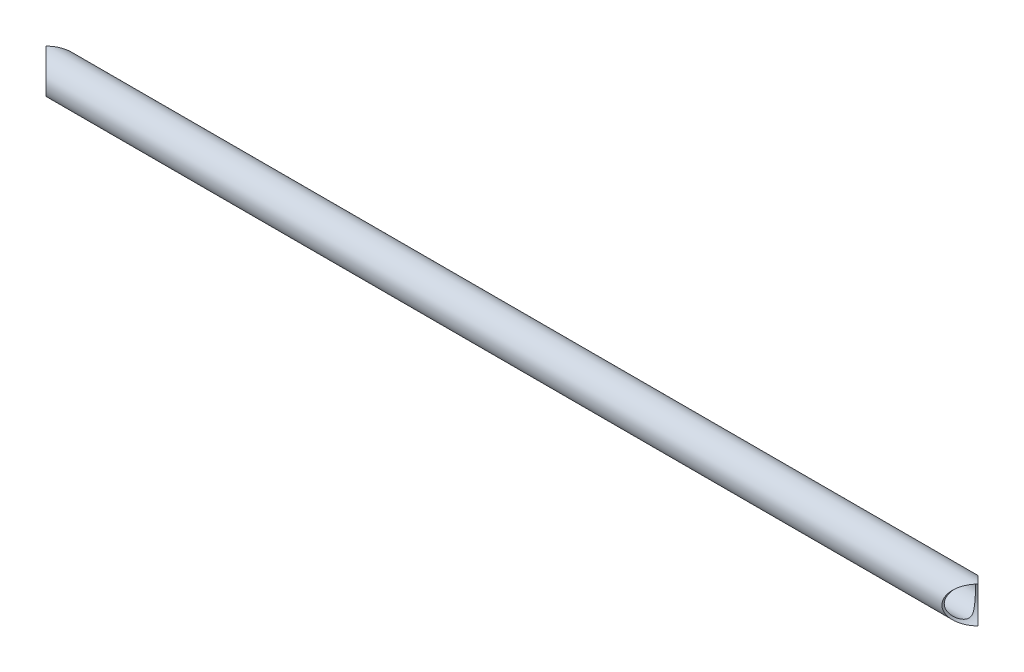
ISO-10303-21;
HEADER;
FILE_DESCRIPTION(('STEP AP214'),'2;1');
FILE_NAME('part.step','',(''),(''),'','','');
FILE_SCHEMA(('AUTOMOTIVE_DESIGN { 1 0 10303 214 1 1 1 1 }'));
ENDSEC;
DATA;
#1=APPLICATION_CONTEXT('core data for automotive mechanical design processes');
#2=APPLICATION_PROTOCOL_DEFINITION('international standard','automotive_design',2000,#1);
#3=PRODUCT_CONTEXT('',#1,'mechanical');
#4=PRODUCT('Part','Part','',(#3));
#5=PRODUCT_RELATED_PRODUCT_CATEGORY('part','',(#4));
#6=PRODUCT_DEFINITION_FORMATION('','',#4);
#7=PRODUCT_DEFINITION_CONTEXT('part definition',#1,'design');
#8=PRODUCT_DEFINITION('design','',#6,#7);
#9=PRODUCT_DEFINITION_SHAPE('','',#8);
#10=(LENGTH_UNIT() NAMED_UNIT(*) SI_UNIT(.MILLI.,.METRE.));
#11=(NAMED_UNIT(*) PLANE_ANGLE_UNIT() SI_UNIT($,.RADIAN.));
#12=(NAMED_UNIT(*) SI_UNIT($,.STERADIAN.) SOLID_ANGLE_UNIT());
#13=UNCERTAINTY_MEASURE_WITH_UNIT(LENGTH_MEASURE(1.E-05),#10,'distance_accuracy_value','');
#14=(GEOMETRIC_REPRESENTATION_CONTEXT(3) GLOBAL_UNCERTAINTY_ASSIGNED_CONTEXT((#13)) GLOBAL_UNIT_ASSIGNED_CONTEXT((#10,
#11,#12)) REPRESENTATION_CONTEXT('',''));
#15=CARTESIAN_POINT('',(0.,0.,0.));
#16=DIRECTION('',(0.,0.,1.));
#17=DIRECTION('',(1.,0.,0.));
#18=AXIS2_PLACEMENT_3D('',#15,#16,#17);
#19=CARTESIAN_POINT('',(326.558909505122,70.7323036314135,-453.319741375355));
#20=DIRECTION('',(-1.,0.,0.));
#21=DIRECTION('',(0.,0.,1.));
#22=AXIS2_PLACEMENT_3D('',#19,#20,#21);
#23=CYLINDRICAL_SURFACE('',#22,12.7);
#24=CARTESIAN_POINT('',(326.558909505122,70.7323036314135,-453.319741375355));
#25=DIRECTION('',(-0.704053417957916,0.000292435905976184,0.710146956018975));
#26=DIRECTION('',(-0.710147016230988,-0.000289926584820265,-0.704053358262568));
#27=AXIS2_PLACEMENT_3D('',#24,#25,#26);
#28=ELLIPSE('',#27,18.038404013201,12.7);
#29=CARTESIAN_POINT('',(326.558909505122,58.0323047082223,-453.314511562484));
#30=VERTEX_POINT('',#29);
#31=CARTESIAN_POINT('',(326.558909505122,83.4323025546047,-453.324971188226));
#32=VERTEX_POINT('',#31);
#33=EDGE_CURVE('E74',#30,#32,#28,.F.);
#34=ORIENTED_EDGE('',*,*,#33,.F.);
#35=CARTESIAN_POINT('',(326.558909505122,70.7323036314135,-453.319741375355));
#36=DIRECTION('',(-0.710147016230988,-0.000289926584820265,-0.704053358262568));
#37=DIRECTION('',(-0.704053417957916,0.000292435905976184,0.710146956018975));
#38=AXIS2_PLACEMENT_3D('',#35,#36,#37);
#39=ELLIPSE('',#38,17.8836208696666,12.7);
#40=EDGE_CURVE('E76',#32,#30,#39,.F.);
#41=ORIENTED_EDGE('',*,*,#40,.F.);
#42=EDGE_LOOP('',(#34,#41));
#43=FACE_BOUND('',#42,.T.);
#44=CARTESIAN_POINT('',(-326.558909505122,70.7323036314134,-453.319741375355));
#45=DIRECTION('',(-0.710147016230988,0.000289926584820265,0.704053358262568));
#46=DIRECTION('',(-0.704053417957916,-0.000292435905976184,-0.710146956018975));
#47=AXIS2_PLACEMENT_3D('',#44,#45,#46);
#48=ELLIPSE('',#47,17.8836208696666,12.7);
#49=CARTESIAN_POINT('',(-326.558909505122,58.0323047082223,-453.314511562484));
#50=VERTEX_POINT('',#49);
#51=CARTESIAN_POINT('',(-326.558909505122,83.4323025546046,-453.324971188226));
#52=VERTEX_POINT('',#51);
#53=EDGE_CURVE('E80',#50,#52,#48,.T.);
#54=ORIENTED_EDGE('',*,*,#53,.F.);
#55=CARTESIAN_POINT('',(-326.558909505122,70.7323036314134,-453.319741375355));
#56=DIRECTION('',(-0.704053417957916,-0.000292435905976184,-0.710146956018975));
#57=DIRECTION('',(-0.710147016230988,0.000289926584820265,0.704053358262568));
#58=AXIS2_PLACEMENT_3D('',#55,#56,#57);
#59=ELLIPSE('',#58,18.038404013201,12.7);
#60=EDGE_CURVE('E66',#52,#50,#59,.T.);
#61=ORIENTED_EDGE('',*,*,#60,.F.);
#62=EDGE_LOOP('',(#54,#61));
#63=FACE_BOUND('',#62,.T.);
#64=ADVANCED_FACE('F43',(#43,#63),#23,.T.);
#65=CARTESIAN_POINT('',(326.042536736013,70.7076293309975,-513.238441419259));
#66=DIRECTION('',(0.00861756932355122,0.000411780998272304,0.999962783275139));
#67=DIRECTION('',(0.99996286805379,0.,-0.00861757005416431));
#68=AXIS2_PLACEMENT_3D('',#65,#66,#67);
#69=CYLINDRICAL_SURFACE('',#68,12.7);
#70=CARTESIAN_POINT('',(313.953657778091,70.7323036314135,-442.270741375355));
#71=CARTESIAN_POINT('',(313.953750384609,70.472526484591,-442.270741843989));
#72=CARTESIAN_POINT('',(313.961749851804,70.2127458562461,-442.279918544724));
#73=CARTESIAN_POINT('',(313.993377932162,69.6954266215194,-442.316444763389));
#74=CARTESIAN_POINT('',(314.017007112841,69.4378880968927,-442.343794941203));
#75=CARTESIAN_POINT('',(314.079369892673,68.9270657819943,-442.416159638872));
#76=CARTESIAN_POINT('',(314.118109695327,68.6737837837972,-442.461181413657));
#77=CARTESIAN_POINT('',(314.209858477709,68.1734593340531,-442.568082634941));
#78=CARTESIAN_POINT('',(314.262867640864,67.926416962759,-442.629962298142));
#79=CARTESIAN_POINT('',(314.381731547976,67.4416345343575,-442.769143477332));
#80=CARTESIAN_POINT('',(314.447505946992,67.2038469188565,-442.84634860018));
#81=CARTESIAN_POINT('',(314.590919799252,66.7372249728979,-443.015308963089));
#82=CARTESIAN_POINT('',(314.668558969852,66.508390429323,-443.107063856546));
#83=CARTESIAN_POINT('',(314.834462600854,66.0605512168615,-443.304004788081));
#84=CARTESIAN_POINT('',(314.922728476102,65.8415478622463,-443.409192614741));
#85=CARTESIAN_POINT('',(315.108614696286,65.414011448427,-443.631898775433));
#86=CARTESIAN_POINT('',(315.206237079323,65.2054806855807,-443.7494197965));
#87=CARTESIAN_POINT('',(315.448291545058,64.7220021470306,-444.042661769104));
#88=CARTESIAN_POINT('',(315.59639767731,64.4519847388041,-444.223509379589));
#89=CARTESIAN_POINT('',(315.904842718948,63.9332846947992,-444.604389331525));
#90=CARTESIAN_POINT('',(316.065185936007,63.6846096379653,-444.804428435155));
#91=CARTESIAN_POINT('',(316.395369391014,63.2082106606188,-445.222269201203));
#92=CARTESIAN_POINT('',(316.565231304919,62.9805379650057,-445.44011196941));
#93=CARTESIAN_POINT('',(316.910985378339,62.5467486914764,-445.891744711659));
#94=CARTESIAN_POINT('',(317.08687672614,62.340629226971,-446.125532543257));
#95=CARTESIAN_POINT('',(317.44516719062,61.9456976036155,-446.613290953129));
#96=CARTESIAN_POINT('',(317.627625646923,61.7573321430688,-446.867579186042));
#97=CARTESIAN_POINT('',(317.991711156104,61.4027231324545,-447.391880116777));
#98=CARTESIAN_POINT('',(318.173337912839,61.2364869477486,-447.66189800718));
#99=CARTESIAN_POINT('',(318.530572332579,60.9267629066194,-448.217510094873));
#100=CARTESIAN_POINT('',(318.706191806458,60.7832281302903,-448.503070480917));
#101=CARTESIAN_POINT('',(319.045462665007,60.5193073293983,-449.091387965624));
#102=CARTESIAN_POINT('',(319.209123707533,60.3989024937002,-449.39413082827));
#103=CARTESIAN_POINT('',(319.441231485734,60.2352411899231,-449.867063903036));
#104=CARTESIAN_POINT('',(319.51737342054,60.1828816126961,-450.030363517275));
#105=CARTESIAN_POINT('',(319.662500345144,60.0850811254469,-450.36221080617));
#106=CARTESIAN_POINT('',(319.731484216292,60.0396412963131,-450.530759295775));
#107=CARTESIAN_POINT('',(319.860299783904,59.9562229691269,-450.872820646944));
#108=CARTESIAN_POINT('',(319.920146307257,59.9182323543624,-451.046324911842));
#109=CARTESIAN_POINT('',(320.028683775289,59.8501914811312,-451.398252747902));
#110=CARTESIAN_POINT('',(320.077381329584,59.820136516421,-451.57667333378));
#111=CARTESIAN_POINT('',(320.15534802078,59.7723052464335,-451.911510015253));
#112=CARTESIAN_POINT('',(320.186414747412,59.753377528516,-452.067340866681));
#113=CARTESIAN_POINT('',(320.237606489603,59.7220909253879,-452.381393505433));
#114=CARTESIAN_POINT('',(320.257736680896,59.7097289329985,-452.539614125293));
#115=CARTESIAN_POINT('',(320.286139772453,59.6918364829635,-452.857375771543));
#116=CARTESIAN_POINT('',(320.294422995715,59.6863000783417,-453.016915526399));
#117=CARTESIAN_POINT('',(320.298738383635,59.6821620675106,-453.336254511301));
#118=CARTESIAN_POINT('',(320.294770416488,59.6835605359116,-453.49605374412));
#119=CARTESIAN_POINT('',(320.274755361757,59.6932364090369,-453.814427844494));
#120=CARTESIAN_POINT('',(320.25872718399,59.7015030469207,-453.973004236574));
#121=CARTESIAN_POINT('',(320.21533099613,59.7246865718795,-454.2881294581));
#122=CARTESIAN_POINT('',(320.187958164381,59.7396062868207,-454.444677396211));
#123=CARTESIAN_POINT('',(320.090344181383,59.7939297564818,-454.910321416115));
#124=CARTESIAN_POINT('',(320.004627099982,59.842889010753,-455.215153915057));
#125=CARTESIAN_POINT('',(319.820072380998,59.952902063723,-455.758675901912));
#126=CARTESIAN_POINT('',(319.725959315913,60.0104734076138,-455.999785051794));
#127=CARTESIAN_POINT('',(319.522424038838,60.139605976522,-456.471721811508));
#128=CARTESIAN_POINT('',(319.412991063094,60.2111770519048,-456.702542040713));
#129=CARTESIAN_POINT('',(319.183016012673,60.3675105510868,-457.154971254365));
#130=CARTESIAN_POINT('',(319.06243608797,60.4523186467134,-457.376544848422));
#131=CARTESIAN_POINT('',(318.814050414943,60.6342489446226,-457.810282703948));
#132=CARTESIAN_POINT('',(318.686245530333,60.731369676698,-458.022448084741));
#133=CARTESIAN_POINT('',(318.354590472351,60.9942594297167,-458.552361322893));
#134=CARTESIAN_POINT('',(318.147575372734,61.1684065767729,-458.864001484977));
#135=CARTESIAN_POINT('',(317.730320903922,61.544830735874,-459.467689309739));
#136=CARTESIAN_POINT('',(317.520079914677,61.7471223228399,-459.759726703983));
#137=CARTESIAN_POINT('',(317.102458335844,62.1795700578821,-460.323830795833));
#138=CARTESIAN_POINT('',(316.895074441852,62.4096903599618,-460.595922474445));
#139=CARTESIAN_POINT('',(316.487905882164,62.8982258680933,-461.119466182125));
#140=CARTESIAN_POINT('',(316.288117758095,63.1566279843523,-461.370927666057));
#141=CARTESIAN_POINT('',(315.948209064898,63.6351978960449,-461.792447590752));
#142=CARTESIAN_POINT('',(315.805456492202,63.8492357761126,-461.967362073244));
#143=CARTESIAN_POINT('',(315.528971290505,64.2935620890431,-462.303087706612));
#144=CARTESIAN_POINT('',(315.395236658273,64.523846889428,-462.463901992083));
#145=CARTESIAN_POINT('',(315.139047423935,65.0001563462388,-462.769762095723));
#146=CARTESIAN_POINT('',(315.016579102139,65.2461612233881,-462.914827132603));
#147=CARTESIAN_POINT('',(314.78495368658,65.7535736073472,-463.187647397329));
#148=CARTESIAN_POINT('',(314.675794042988,66.0149781494332,-463.315405941473));
#149=CARTESIAN_POINT('',(314.491433334378,66.5033952202067,-463.530247403956));
#150=CARTESIAN_POINT('',(314.413664097965,66.7280456364559,-463.620504951854));
#151=CARTESIAN_POINT('',(314.269781667784,67.1860773596022,-463.787025163699));
#152=CARTESIAN_POINT('',(314.203665995233,67.4194567969497,-463.863290803953));
#153=CARTESIAN_POINT('',(314.084257722988,67.8937436251614,-464.000748430297));
#154=CARTESIAN_POINT('',(314.030960705053,68.1346483898087,-464.06194561025));
#155=CARTESIAN_POINT('',(313.938188409809,68.6226029280441,-464.168331567883));
#156=CARTESIAN_POINT('',(313.898713280576,68.869652767434,-464.213520174063));
#157=CARTESIAN_POINT('',(313.834250117017,69.3693899943595,-464.287283194732));
#158=CARTESIAN_POINT('',(313.809335701462,69.6220994351456,-464.315773183302));
#159=CARTESIAN_POINT('',(313.774859670757,70.1299320690421,-464.355248058193));
#160=CARTESIAN_POINT('',(313.765298089938,70.3850552675486,-464.366232905372));
#161=CARTESIAN_POINT('',(313.761747926335,70.8955307639237,-464.370483613097));
#162=CARTESIAN_POINT('',(313.767757738824,71.1508830354737,-464.363751299503));
#163=CARTESIAN_POINT('',(313.79520906931,71.6596679820036,-464.332704031545));
#164=CARTESIAN_POINT('',(313.816649869899,71.9131007456707,-464.308389894586));
#165=CARTESIAN_POINT('',(313.87215565214,72.3958245540675,-464.245286157614));
#166=CARTESIAN_POINT('',(313.905071369608,72.6254228077189,-464.207812617217));
#167=CARTESIAN_POINT('',(313.982959747622,73.0799025034037,-464.118945537308));
#168=CARTESIAN_POINT('',(314.027936477992,73.3047823255972,-464.067547299037));
#169=CARTESIAN_POINT('',(314.129163155341,73.7484350080498,-463.951576269117));
#170=CARTESIAN_POINT('',(314.185409854194,73.9672096072494,-463.887007273327));
#171=CARTESIAN_POINT('',(314.308324818595,74.3977811332844,-463.745481738444));
#172=CARTESIAN_POINT('',(314.374996977284,74.6095754175687,-463.668520571468));
#173=CARTESIAN_POINT('',(314.523190153128,75.0409900471927,-463.496847660192));
#174=CARTESIAN_POINT('',(314.605451431234,75.2599979051564,-463.401235444747));
#175=CARTESIAN_POINT('',(314.779713287132,75.6882622840656,-463.197754594864));
#176=CARTESIAN_POINT('',(314.871717685841,75.8975149326752,-463.089881150768));
#177=CARTESIAN_POINT('',(315.160580190159,76.50991950674,-462.749354911958));
#178=CARTESIAN_POINT('',(315.37032143116,76.8978140560724,-462.499757335818));
#179=CARTESIAN_POINT('',(315.761515485426,77.5430570740608,-462.026863342844));
#180=CARTESIAN_POINT('',(315.937826280868,77.8095080845267,-461.811437801883));
#181=CARTESIAN_POINT('',(316.301048488416,78.3176046632087,-461.360816551208));
#182=CARTESIAN_POINT('',(316.48796487964,78.5592384281019,-461.125611530019));
#183=CARTESIAN_POINT('',(316.868917528617,79.0182462680876,-460.636595373829));
#184=CARTESIAN_POINT('',(317.062970221528,79.2355589909183,-460.382739746404));
#185=CARTESIAN_POINT('',(317.453692146444,79.6454724189226,-459.857837590452));
#186=CARTESIAN_POINT('',(317.650360615463,79.8380801629982,-459.58679599156));
#187=CARTESIAN_POINT('',(318.008038815581,80.1676847909596,-459.075596514788));
#188=CARTESIAN_POINT('',(318.16936459994,80.3085489646998,-458.838143201432));
#189=CARTESIAN_POINT('',(318.487442631339,80.5732904743881,-458.350875019481));
#190=CARTESIAN_POINT('',(318.644193812169,80.6971638747747,-458.101057305103));
#191=CARTESIAN_POINT('',(318.948468080147,80.927069140057,-457.588900251279));
#192=CARTESIAN_POINT('',(319.096014980986,81.0331483571577,-457.326596608519));
#193=CARTESIAN_POINT('',(319.376549475645,81.2267689498648,-456.787956983957));
#194=CARTESIAN_POINT('',(319.509548547914,81.314324992233,-456.511632320675));
#195=CARTESIAN_POINT('',(319.766862187957,81.4778148108596,-455.91222219676));
#196=CARTESIAN_POINT('',(319.888619419885,81.5514166103108,-455.587333904903));
#197=CARTESIAN_POINT('',(320.040230201277,81.6403403561355,-455.087161058489));
#198=CARTESIAN_POINT('',(320.085574679541,81.6663906851969,-454.918423355312));
#199=CARTESIAN_POINT('',(320.164159929901,81.7108625511446,-454.57720198217));
#200=CARTESIAN_POINT('',(320.197407215761,81.7292881942987,-454.404720381294));
#201=CARTESIAN_POINT('',(320.2505633445,81.7582417985473,-454.054785177665));
#202=CARTESIAN_POINT('',(320.270298653214,81.7686672106685,-453.877296302454));
#203=CARTESIAN_POINT('',(320.294659860307,81.7809084069078,-453.520986007946));
#204=CARTESIAN_POINT('',(320.299287077398,81.7827249424598,-453.342164706316));
#205=CARTESIAN_POINT('',(320.293196402926,81.7776729822997,-452.984845599121));
#206=CARTESIAN_POINT('',(320.282472840093,81.7708012768698,-452.80634793752));
#207=CARTESIAN_POINT('',(320.246355890164,81.7485643821527,-452.451383716925));
#208=CARTESIAN_POINT('',(320.220960157298,81.7331978347372,-452.274917487317));
#209=CARTESIAN_POINT('',(320.152348164958,81.6916125271343,-451.900481447509));
#210=CARTESIAN_POINT('',(320.107111445623,81.6641613654858,-451.703021863818));
#211=CARTESIAN_POINT('',(320.002018430777,81.5994473410464,-451.313597359277));
#212=CARTESIAN_POINT('',(319.942150499697,81.5621766673724,-451.121636948095));
#213=CARTESIAN_POINT('',(319.810439756687,81.4784662566942,-450.743299797405));
#214=CARTESIAN_POINT('',(319.738561095548,81.4319989910668,-450.556941805609));
#215=CARTESIAN_POINT('',(319.585552469099,81.3306335081465,-450.190535765438));
#216=CARTESIAN_POINT('',(319.504424490278,81.2757371003173,-450.010486372977));
#217=CARTESIAN_POINT('',(319.274227204072,81.115671929268,-449.529091671521));
#218=CARTESIAN_POINT('',(319.118249313267,81.0027373686265,-449.233616588842));
#219=CARTESIAN_POINT('',(318.793981571198,80.7550561065654,-448.65896971818));
#220=CARTESIAN_POINT('',(318.625683136649,80.6202941179604,-448.379809544437));
#221=CARTESIAN_POINT('',(318.282596696257,80.3295754919229,-447.836326558605));
#222=CARTESIAN_POINT('',(318.107800017584,80.1735897321095,-447.572024851469));
#223=CARTESIAN_POINT('',(317.756511661401,79.8408980666099,-447.058147505982));
#224=CARTESIAN_POINT('',(317.580020416533,79.6641973270074,-446.808568219264));
#225=CARTESIAN_POINT('',(317.217156670147,79.2774873719997,-446.307831032799));
#226=CARTESIAN_POINT('',(317.030913854305,79.0660400760352,-446.057686478972));
#227=CARTESIAN_POINT('',(316.664376325206,78.6192790995116,-445.574794271321));
#228=CARTESIAN_POINT('',(316.484082720674,78.3839610031888,-445.342049850159));
#229=CARTESIAN_POINT('',(316.133454120849,77.8898557639405,-444.895941555287));
#230=CARTESIAN_POINT('',(315.963099495482,77.6311176488985,-444.682538984306));
#231=CARTESIAN_POINT('',(315.635605199084,77.0899142470286,-444.276762488547));
#232=CARTESIAN_POINT('',(315.478460226203,76.8074585713925,-444.084380117679));
#233=CARTESIAN_POINT('',(315.221273939928,76.2988683355117,-443.772114528849));
#234=CARTESIAN_POINT('',(315.117272196426,76.0781239479161,-443.646683125049));
#235=CARTESIAN_POINT('',(314.919795960159,75.6248203598707,-443.409693167051));
#236=CARTESIAN_POINT('',(314.82631881434,75.3922641585027,-443.298131115908));
#237=CARTESIAN_POINT('',(314.651453036958,74.9162323589459,-443.090247296199));
#238=CARTESIAN_POINT('',(314.570056454373,74.6727640813585,-442.993915500841));
#239=CARTESIAN_POINT('',(314.420771882033,74.175887727569,-442.817761553033));
#240=CARTESIAN_POINT('',(314.352882958384,73.9224803399894,-442.737938259201));
#241=CARTESIAN_POINT('',(314.237393415828,73.4302352502411,-442.602428297481));
#242=CARTESIAN_POINT('',(314.188523500347,73.1921132579441,-442.545224073337));
#243=CARTESIAN_POINT('',(314.104050199524,72.7103307670541,-442.44645950806));
#244=CARTESIAN_POINT('',(314.068445766956,72.4666707072691,-442.404897932034));
#245=CARTESIAN_POINT('',(314.011220956792,71.9755532395433,-442.338114717019));
#246=CARTESIAN_POINT('',(313.989596838278,71.7280968655969,-442.31288870688));
#247=CARTESIAN_POINT('',(313.960770500003,71.2311959940752,-442.279201477662));
#248=CARTESIAN_POINT('',(313.95356885383,70.9817514178241,-442.270740925354));
#249=CARTESIAN_POINT('',(313.953657778091,70.7323036314135,-442.270741375355));
#250=B_SPLINE_CURVE_WITH_KNOTS('',3,(#70,#71,#72,#73,#74,#75,#76,#77,#78,#79,#80,#81,#82,#83,
#84,#85,#86,#87,#88,#89,#90,#91,#92,#93,#94,#95,#96,#97,#98,#99,#100,#101,#102,#103,#104,#105,
#106,#107,#108,#109,#110,#111,#112,#113,#114,#115,#116,#117,#118,#119,#120,#121,#122,#123,#124,
#125,#126,#127,#128,#129,#130,#131,#132,#133,#134,#135,#136,#137,#138,#139,#140,#141,#142,#143,
#144,#145,#146,#147,#148,#149,#150,#151,#152,#153,#154,#155,#156,#157,#158,#159,#160,#161,#162,
#163,#164,#165,#166,#167,#168,#169,#170,#171,#172,#173,#174,#175,#176,#177,#178,#179,#180,#181,
#182,#183,#184,#185,#186,#187,#188,#189,#190,#191,#192,#193,#194,#195,#196,#197,#198,#199,#200,
#201,#202,#203,#204,#205,#206,#207,#208,#209,#210,#211,#212,#213,#214,#215,#216,#217,#218,#219,
#220,#221,#222,#223,#224,#225,#226,#227,#228,#229,#230,#231,#232,#233,#234,#235,#236,#237,#238,
#239,#240,#241,#242,#243,#244,#245,#246,#247,#248,#249),.UNSPECIFIED.,.T.,.F.,(4,2,2,2,2,2,2,2,
2,2,2,2,2,2,2,2,2,2,2,2,2,2,2,2,2,2,2,2,2,2,2,2,2,2,2,2,2,2,2,2,2,2,2,2,2,2,2,2,2,2,2,2,2,2,2,2,
2,2,2,2,2,2,2,2,2,2,2,2,2,2,2,2,2,2,2,2,2,2,2,2,2,2,2,2,2,2,2,2,2,4),(0.,0.779063181034952,
1.55815465154095,2.33756630687256,3.11698798173117,3.8916543509592,4.66630226894222,
5.44105343833116,6.2159737546437,7.28584280564568,8.35609022238037,9.42888253606805,
10.5015309879065,11.5963881169998,12.6916087448052,13.7845352940028,14.8765691886967,
15.439197580439,16.0019137667098,16.5637069180524,17.1251661453653,17.6047515608577,
18.0841098135908,18.5630501167694,19.0419955727358,19.5201916265661,19.9985911299149,
20.9561749170176,21.7505879008784,22.5455618662405,23.3433419773811,24.1410269180676,
25.3774262777863,26.6144683210135,27.8499335788921,29.0848294200451,30.0173611748492,
30.9496850914035,31.8808581985712,32.8118526196321,33.5739791893177,34.3359434538729,
35.0976447124391,35.8593541308749,36.6248821494495,37.3904118797828,38.1558627207305,
38.9212779770304,39.6253595031716,40.3296789116487,41.0337956189602,41.7381758927384,
42.4956222455243,43.2533667506294,44.7685317750617,45.9232129043498,47.0784406925276,
48.236519925571,49.3942684641531,50.352920095885,51.311793405813,52.2680731177756,
53.2235927840225,54.2840369602062,54.8134938766763,55.3426652823424,55.8785113936687,
56.4143107323068,56.9503080704384,57.4863911269098,58.0987003395419,58.7114980888352,
59.3261586823899,59.9406875122331,60.997078093966,62.0542117604666,63.1128108922045,
64.1711465805651,65.3003492832584,66.4297612548904,67.556861287258,68.6835067630405,
69.5058894047594,70.3280642729801,71.1496955905185,71.9712700822691,72.7195854909989,
73.4678418123789,74.2158978288354,74.9639835952709),.UNSPECIFIED.);
#251=CARTESIAN_POINT('',(313.953657778091,70.7323036314135,-442.270741375355));
#252=VERTEX_POINT('',#251);
#253=EDGE_CURVE('E48',#252,#252,#250,.T.);
#254=ORIENTED_EDGE('',*,*,#253,.F.);
#255=EDGE_LOOP('',(#254));
#256=FACE_BOUND('',#255,.T.);
#257=ORIENTED_EDGE('',*,*,#33,.T.);
#258=ORIENTED_EDGE('',*,*,#40,.T.);
#259=EDGE_LOOP('',(#257,#258));
#260=FACE_BOUND('',#259,.T.);
#261=ADVANCED_FACE('F77',(#256,#260),#69,.F.);
#262=CARTESIAN_POINT('',(-326.042536736013,70.7076293309975,-513.238441419259));
#263=DIRECTION('',(-0.00861756932355122,0.000411780998272304,0.999962783275139));
#264=DIRECTION('',(0.99996286805379,0.,0.00861757005416431));
#265=AXIS2_PLACEMENT_3D('',#262,#263,#264);
#266=CYLINDRICAL_SURFACE('',#265,12.7);
#267=CARTESIAN_POINT('',(-313.953657778091,70.7323036314135,-442.270741375355));
#268=CARTESIAN_POINT('',(-313.953566113715,70.9919748126506,-442.270741835412));
#269=CARTESIAN_POINT('',(-313.961374856135,71.2516549925268,-442.279911042693));
#270=CARTESIAN_POINT('',(-313.992613104889,71.7687866192135,-442.316409877657));
#271=CARTESIAN_POINT('',(-314.016043165128,72.0262379866662,-442.3437401493));
#272=CARTESIAN_POINT('',(-314.078003811742,72.5368990422149,-442.416055278275));
#273=CARTESIAN_POINT('',(-314.116540538306,72.7901069618448,-442.461047314339));
#274=CARTESIAN_POINT('',(-314.207883734015,73.2902969790176,-442.56788187966));
#275=CARTESIAN_POINT('',(-314.260690388583,73.537278995615,-442.629724627876));
#276=CARTESIAN_POINT('',(-314.379155890151,74.0219577664736,-442.768828352544));
#277=CARTESIAN_POINT('',(-314.444734608009,74.2597018617291,-442.84599325724));
#278=CARTESIAN_POINT('',(-314.587764657419,74.7262465881928,-443.014869935208));
#279=CARTESIAN_POINT('',(-314.665215706332,74.9550474321458,-443.106581362181));
#280=CARTESIAN_POINT('',(-314.830753095391,75.4028279718731,-443.303433136024));
#281=CARTESIAN_POINT('',(-314.918840900351,75.621806309258,-443.408575332594));
#282=CARTESIAN_POINT('',(-315.104382185685,76.0492983208627,-443.631187636917));
#283=CARTESIAN_POINT('',(-315.20183770619,76.257809700434,-443.748660430583));
#284=CARTESIAN_POINT('',(-315.443450037247,76.7411277150045,-444.041711692478));
#285=CARTESIAN_POINT('',(-315.591279888014,77.0110145639812,-444.222406251304));
#286=CARTESIAN_POINT('',(-315.899189021182,77.5294758984755,-444.602956184328));
#287=CARTESIAN_POINT('',(-316.059272610038,77.7780428256374,-444.80281830107));
#288=CARTESIAN_POINT('',(-316.388956497433,78.254241624503,-445.220275373082));
#289=CARTESIAN_POINT('',(-316.55857836126,78.4818227114813,-445.43791105982));
#290=CARTESIAN_POINT('',(-316.903883727655,78.9154496010986,-445.889100028556));
#291=CARTESIAN_POINT('',(-317.079566419469,79.1214982693731,-446.122651185596));
#292=CARTESIAN_POINT('',(-317.437474711912,79.5163042659558,-446.609890481796));
#293=CARTESIAN_POINT('',(-317.619760483582,79.7046157677131,-446.86389522236));
#294=CARTESIAN_POINT('',(-317.983562531728,80.0591415562298,-447.387580785275));
#295=CARTESIAN_POINT('',(-318.165078536221,80.2253485754004,-447.657266721666));
#296=CARTESIAN_POINT('',(-318.522189591292,80.535050687914,-448.212164250168));
#297=CARTESIAN_POINT('',(-318.697796094659,80.678591972834,-448.497342631652));
#298=CARTESIAN_POINT('',(-319.037181885369,80.94256880928,-449.084825159397));
#299=CARTESIAN_POINT('',(-319.200970595247,81.0630228984657,-449.387115311119));
#300=CARTESIAN_POINT('',(-319.433650637201,81.2269584834218,-449.859741120437));
#301=CARTESIAN_POINT('',(-319.510142682044,81.2795018138273,-450.023227626519));
#302=CARTESIAN_POINT('',(-319.655997622739,81.3776521366163,-450.355458936987));
#303=CARTESIAN_POINT('',(-319.725359396432,81.4232580377308,-450.524204563621));
#304=CARTESIAN_POINT('',(-319.854956574397,81.5069917189025,-450.866678714025));
#305=CARTESIAN_POINT('',(-319.915206604253,81.5451315126847,-451.040398708418));
#306=CARTESIAN_POINT('',(-320.024568932654,81.6134524835427,-451.392781922211));
#307=CARTESIAN_POINT('',(-320.07368783255,81.64363837944,-451.571442140876));
#308=CARTESIAN_POINT('',(-320.152398053335,81.6916677729946,-451.906576814849));
#309=CARTESIAN_POINT('',(-320.18379750237,81.7106726238846,-452.062457948122));
#310=CARTESIAN_POINT('',(-320.235670554077,81.7421107258356,-452.376634748922));
#311=CARTESIAN_POINT('',(-320.256149336063,81.7545470920861,-452.53492923517));
#312=CARTESIAN_POINT('',(-320.28525095294,81.772582128724,-452.85286310505));
#313=CARTESIAN_POINT('',(-320.293884425908,81.7781869339192,-453.012501152219));
#314=CARTESIAN_POINT('',(-320.298886137781,81.782452300361,-453.332066158832));
#315=CARTESIAN_POINT('',(-320.295254261112,81.7811127961732,-453.491993120984));
#316=CARTESIAN_POINT('',(-320.275879323942,81.7715409624782,-453.81066838932));
#317=CARTESIAN_POINT('',(-320.260153679186,81.7633185432725,-453.969418059254));
#318=CARTESIAN_POINT('',(-320.217318359931,81.7402063329837,-454.284906623535));
#319=CARTESIAN_POINT('',(-320.190203840837,81.7253137043505,-454.441644632888));
#320=CARTESIAN_POINT('',(-320.093289210821,81.671044094681,-454.907872683617));
#321=CARTESIAN_POINT('',(-320.007937136263,81.6220841716663,-455.213111284494));
#322=CARTESIAN_POINT('',(-319.824195458523,81.5122003988433,-455.75642299212));
#323=CARTESIAN_POINT('',(-319.730636887644,81.454825911992,-455.996961187263));
#324=CARTESIAN_POINT('',(-319.528210555326,81.3261540726652,-456.467799061041));
#325=CARTESIAN_POINT('',(-319.419332091195,81.2548469730186,-456.698091432483));
#326=CARTESIAN_POINT('',(-319.190449708165,81.0991079860429,-457.149494938442));
#327=CARTESIAN_POINT('',(-319.070407937404,81.0146307350828,-457.370570860592));
#328=CARTESIAN_POINT('',(-318.823068996823,80.8334282016704,-457.803342267586));
#329=CARTESIAN_POINT('',(-318.695772681117,80.7367043594383,-458.01503885151));
#330=CARTESIAN_POINT('',(-318.364843281721,80.4744971620931,-458.54463273614));
#331=CARTESIAN_POINT('',(-318.157991555208,80.3006087050468,-458.856386907299));
#332=CARTESIAN_POINT('',(-317.74095670903,79.9247292790232,-459.460278155837));
#333=CARTESIAN_POINT('',(-317.530771904024,79.7227236635695,-459.752404890755));
#334=CARTESIAN_POINT('',(-317.11316681226,79.2908767187753,-460.316688604668));
#335=CARTESIAN_POINT('',(-316.905743396089,79.0610705272928,-460.588870108134));
#336=CARTESIAN_POINT('',(-316.498410376089,78.573199058902,-461.112605353471));
#337=CARTESIAN_POINT('',(-316.298497361002,78.3151468251178,-461.364168523167));
#338=CARTESIAN_POINT('',(-315.958035508694,77.836859913136,-461.786211839175));
#339=CARTESIAN_POINT('',(-315.814885803081,77.6227195079447,-461.961518846967));
#340=CARTESIAN_POINT('',(-315.537588411444,77.1781476104,-462.298002980793));
#341=CARTESIAN_POINT('',(-315.40343873105,76.9477197506795,-462.459183239702));
#342=CARTESIAN_POINT('',(-315.146410738637,76.4710822114018,-462.765746323618));
#343=CARTESIAN_POINT('',(-315.02351863857,76.2248924822503,-462.911148514697));
#344=CARTESIAN_POINT('',(-314.791044029924,75.7170633484051,-463.184612682993));
#345=CARTESIAN_POINT('',(-314.681458955542,75.4554269365789,-463.312678003578));
#346=CARTESIAN_POINT('',(-314.496402348084,74.966728298964,-463.527962974369));
#347=CARTESIAN_POINT('',(-314.418352479927,74.7420445633482,-463.618374067767));
#348=CARTESIAN_POINT('',(-314.273899897704,74.2839256451875,-463.785197741084));
#349=CARTESIAN_POINT('',(-314.207494700491,74.0504923413459,-463.861613305608));
#350=CARTESIAN_POINT('',(-314.087502703823,73.5760740203083,-463.999364776657));
#351=CARTESIAN_POINT('',(-314.033911495955,73.3350916325961,-464.060705869472));
#352=CARTESIAN_POINT('',(-313.940551391835,72.8469560016073,-464.167370173587));
#353=CARTESIAN_POINT('',(-313.900782643944,72.5998026921263,-464.212693212959));
#354=CARTESIAN_POINT('',(-313.835736369589,72.0998221429051,-464.286713299015));
#355=CARTESIAN_POINT('',(-313.810533033087,71.8469725538917,-464.315325234216));
#356=CARTESIAN_POINT('',(-313.775493877084,71.3388335870774,-464.355024009255));
#357=CARTESIAN_POINT('',(-313.765658091853,71.0835442038369,-464.366110810012));
#358=CARTESIAN_POINT('',(-313.761580843441,70.5727149380208,-464.370540844382));
#359=CARTESIAN_POINT('',(-313.767337698953,70.3171750854226,-464.363885991025));
#360=CARTESIAN_POINT('',(-313.794309902967,69.8079977260303,-464.332965581713));
#361=CARTESIAN_POINT('',(-313.815524522446,69.5543601300916,-464.30870085628));
#362=CARTESIAN_POINT('',(-313.870608830926,69.071380764004,-464.245682249731));
#363=CARTESIAN_POINT('',(-313.903318796923,68.8417304424476,-464.208256009403));
#364=CARTESIAN_POINT('',(-313.980808600332,68.3871360384955,-464.119474804133));
#365=CARTESIAN_POINT('',(-314.02559251071,68.1621935718697,-464.068115138919));
#366=CARTESIAN_POINT('',(-314.126448853829,67.7184082933215,-463.952211555044));
#367=CARTESIAN_POINT('',(-314.182518037886,67.4995637465878,-463.887671430556));
#368=CARTESIAN_POINT('',(-314.305094511949,67.0688482936989,-463.746193794258));
#369=CARTESIAN_POINT('',(-314.371605702584,66.8569800294675,-463.669251649367));
#370=CARTESIAN_POINT('',(-314.519432349192,66.4255577128326,-463.497666881247));
#371=CARTESIAN_POINT('',(-314.601482212551,66.2066101398362,-463.402131800619));
#372=CARTESIAN_POINT('',(-314.775329071512,65.778455252955,-463.198811066483));
#373=CARTESIAN_POINT('',(-314.867129890115,65.569251805979,-463.091020606904));
#374=CARTESIAN_POINT('',(-315.155395088011,64.9569834390693,-462.75075292575));
#375=CARTESIAN_POINT('',(-315.364756948786,64.5691616642111,-462.501339401088));
#376=CARTESIAN_POINT('',(-315.755292454473,63.9240810483349,-462.028834647986));
#377=CARTESIAN_POINT('',(-315.931310594871,63.6577199438781,-461.813613224117));
#378=CARTESIAN_POINT('',(-316.293977941672,63.1497807512471,-461.363427720422));
#379=CARTESIAN_POINT('',(-316.48063213334,62.9082144358278,-461.128454357657));
#380=CARTESIAN_POINT('',(-316.861103439609,62.4493163255523,-460.639930917061));
#381=CARTESIAN_POINT('',(-317.054937198417,62.2320462328741,-460.386336135547));
#382=CARTESIAN_POINT('',(-317.44527663091,61.8221959337643,-459.861996354473));
#383=CARTESIAN_POINT('',(-317.641781532366,61.6296087526102,-459.591256232173));
#384=CARTESIAN_POINT('',(-317.999885903861,61.2994158699284,-459.079724013972));
#385=CARTESIAN_POINT('',(-318.161783596384,61.1580150818903,-458.841580670895));
#386=CARTESIAN_POINT('',(-318.481030512705,60.8923157251311,-458.352875965238));
#387=CARTESIAN_POINT('',(-318.638378658326,60.7680211845312,-458.102311696649));
#388=CARTESIAN_POINT('',(-318.943842671232,60.5373922013334,-457.588607785696));
#389=CARTESIAN_POINT('',(-319.091982451814,60.4310098977804,-457.325504144929));
#390=CARTESIAN_POINT('',(-319.373663802819,60.2369036561523,-456.78519903499));
#391=CARTESIAN_POINT('',(-319.507216976625,60.1491648342052,-456.508009032309));
#392=CARTESIAN_POINT('',(-319.765188088883,59.9856877661448,-455.907641291805));
#393=CARTESIAN_POINT('',(-319.887119427826,59.9122218415735,-455.582709437822));
#394=CARTESIAN_POINT('',(-320.039026561734,59.8235081043311,-455.08247228305));
#395=CARTESIAN_POINT('',(-320.084475612986,59.7975287512799,-454.913713262543));
#396=CARTESIAN_POINT('',(-320.163279578721,59.753200939767,-454.572447166691));
#397=CARTESIAN_POINT('',(-320.196640999549,59.734848375291,-454.399942160838));
#398=CARTESIAN_POINT('',(-320.250033333903,59.7060437238132,-454.049949109124));
#399=CARTESIAN_POINT('',(-320.269890316048,59.6956944921822,-453.872425634153));
#400=CARTESIAN_POINT('',(-320.294492955703,59.6836093040673,-453.516039620543));
#401=CARTESIAN_POINT('',(-320.299239941809,59.6818725902926,-453.33717720102));
#402=CARTESIAN_POINT('',(-320.293379643938,59.6870885847406,-452.979771880701));
#403=CARTESIAN_POINT('',(-320.282766857299,59.6940444069565,-452.801229117369));
#404=CARTESIAN_POINT('',(-320.246856577263,59.7164541387413,-452.446171487923));
#405=CARTESIAN_POINT('',(-320.221556742621,59.731909403176,-452.269656949703));
#406=CARTESIAN_POINT('',(-320.153169112933,59.7736660916635,-451.89532727376));
#407=CARTESIAN_POINT('',(-320.108076261831,59.8011895213577,-451.698017875733));
#408=CARTESIAN_POINT('',(-320.00327487818,59.8660330216236,-451.308886801896));
#409=CARTESIAN_POINT('',(-319.943554731309,59.9033608787902,-451.117069622846));
#410=CARTESIAN_POINT('',(-319.812137739762,59.9871716069491,-450.739014553256));
#411=CARTESIAN_POINT('',(-319.740405028524,60.033681971372,-450.55279540186));
#412=CARTESIAN_POINT('',(-319.587682628775,60.1351197528026,-450.186664427983));
#413=CARTESIAN_POINT('',(-319.5066949225,60.1900453682852,-450.006751265631));
#414=CARTESIAN_POINT('',(-319.276885294568,60.3501598876105,-449.525759819873));
#415=CARTESIAN_POINT('',(-319.121149944223,60.4630984864808,-449.230548950637));
#416=CARTESIAN_POINT('',(-318.797344137791,60.7107415005181,-448.656427450175));
#417=CARTESIAN_POINT('',(-318.629265076744,60.845461179693,-448.377528438189));
#418=CARTESIAN_POINT('',(-318.286591160686,61.1360474283548,-447.834563896927));
#419=CARTESIAN_POINT('',(-318.111987591331,61.2919430703798,-447.570519478959));
#420=CARTESIAN_POINT('',(-317.761055540064,61.6244048328241,-447.057149139587));
#421=CARTESIAN_POINT('',(-317.584727498314,61.8009657985291,-446.807819570984));
#422=CARTESIAN_POINT('',(-317.222119445055,62.1873828531196,-446.307521414614));
#423=CARTESIAN_POINT('',(-317.035967264156,62.3986792852733,-446.057569390902));
#424=CARTESIAN_POINT('',(-316.669568775437,62.8450897331789,-445.575047909427));
#425=CARTESIAN_POINT('',(-316.489323565833,63.0802081449984,-445.342481673819));
#426=CARTESIAN_POINT('',(-316.138741186204,63.5738677721819,-444.896703343436));
#427=CARTESIAN_POINT('',(-315.968384571034,63.8323602721328,-444.683452768467));
#428=CARTESIAN_POINT('',(-315.640829193313,64.3730265948474,-444.27794528496));
#429=CARTESIAN_POINT('',(-315.483625183701,64.6551908832168,-444.085679995203));
#430=CARTESIAN_POINT('',(-315.226131564987,65.1635348059515,-443.773396967514));
#431=CARTESIAN_POINT('',(-315.121909283577,65.3843501730292,-443.64785924655));
#432=CARTESIAN_POINT('',(-314.923983870488,65.8378098985292,-443.410666439976));
#433=CARTESIAN_POINT('',(-314.830278092282,66.0704512593777,-443.299007860853));
#434=CARTESIAN_POINT('',(-314.6549501046,66.5466698144395,-443.090941754105));
#435=CARTESIAN_POINT('',(-314.573319963988,66.7902396926735,-442.994524213467));
#436=CARTESIAN_POINT('',(-314.423567322556,67.2873371109409,-442.818211671766));
#437=CARTESIAN_POINT('',(-314.355443881803,67.5408639565952,-442.738315520958));
#438=CARTESIAN_POINT('',(-314.23952147936,68.0333061932944,-442.602694890651));
#439=CARTESIAN_POINT('',(-314.190450299983,68.2715027906627,-442.545448415453));
#440=CARTESIAN_POINT('',(-314.105576066383,68.7534483360159,-442.446608220466));
#441=CARTESIAN_POINT('',(-314.069771965704,68.997196844477,-442.405013266142));
#442=CARTESIAN_POINT('',(-314.012153670041,69.4885041494012,-442.338174787273));
#443=CARTESIAN_POINT('',(-313.990335682524,69.7360618942753,-442.31292682999));
#444=CARTESIAN_POINT('',(-313.961131503515,70.233178147415,-442.279209575319));
#445=CARTESIAN_POINT('',(-313.953745875638,70.4827367334358,-442.2707409332));
#446=CARTESIAN_POINT('',(-313.953657778091,70.7323036314135,-442.270741375355));
#447=B_SPLINE_CURVE_WITH_KNOTS('',3,(#267,#268,#269,#270,#271,#272,#273,#274,#275,#276,#277,
#278,#279,#280,#281,#282,#283,#284,#285,#286,#287,#288,#289,#290,#291,#292,#293,#294,#295,#296,
#297,#298,#299,#300,#301,#302,#303,#304,#305,#306,#307,#308,#309,#310,#311,#312,#313,#314,#315,
#316,#317,#318,#319,#320,#321,#322,#323,#324,#325,#326,#327,#328,#329,#330,#331,#332,#333,#334,
#335,#336,#337,#338,#339,#340,#341,#342,#343,#344,#345,#346,#347,#348,#349,#350,#351,#352,#353,
#354,#355,#356,#357,#358,#359,#360,#361,#362,#363,#364,#365,#366,#367,#368,#369,#370,#371,#372,
#373,#374,#375,#376,#377,#378,#379,#380,#381,#382,#383,#384,#385,#386,#387,#388,#389,#390,#391,
#392,#393,#394,#395,#396,#397,#398,#399,#400,#401,#402,#403,#404,#405,#406,#407,#408,#409,#410,
#411,#412,#413,#414,#415,#416,#417,#418,#419,#420,#421,#422,#423,#424,#425,#426,#427,#428,#429,
#430,#431,#432,#433,#434,#435,#436,#437,#438,#439,#440,#441,#442,#443,#444,#445,#446),
.UNSPECIFIED.,.T.,.F.,(4,2,2,2,2,2,2,2,2,2,2,2,2,2,2,2,2,2,2,2,2,2,2,2,2,2,2,2,2,2,2,2,2,2,2,2,
2,2,2,2,2,2,2,2,2,2,2,2,2,2,2,2,2,2,2,2,2,2,2,2,2,2,2,2,2,2,2,2,2,2,2,2,2,2,2,2,2,2,2,2,2,2,2,2,
2,2,2,2,2,4),(0.,0.778745370315993,1.55751835509043,2.33660820526928,3.115708179473,
3.89006916248133,4.66441171353229,5.43886102307896,6.21347937857029,7.28247741385748,
8.35185287808507,9.42375175768694,10.4955078017828,11.5894328414794,12.6837166611704,
13.7757407751151,14.8668843505899,15.4305818271198,15.9943678827072,16.5572391545524,
17.1197757351562,17.5997315460564,18.0794595267908,18.5587563890219,19.0380577675529,
19.5166702131005,19.9954864571476,20.953908522476,21.7460503903191,22.538748432968,
23.3342397809738,24.1296376645633,25.3657185548238,26.602445757171,27.8376258469123,
29.0722379569438,30.0061889929106,30.9399323806625,31.8725164053707,32.8049203267977,
33.5675568588448,34.3300305656003,35.0922415789429,35.8544607731262,36.6205289229995,
37.3865987811956,38.1525860397116,38.9185371749479,39.6226618155766,40.3270242801239,
41.0311842695449,41.7356079276633,42.4926039144728,43.2498977955751,44.7641521140217,
45.917903610537,47.0722004073149,48.2293650719767,49.3862020289124,50.3479596547649,
51.3099433659702,52.2693144292103,53.2279166846,54.2885821079021,54.818149902686,
55.3474322249187,55.8834085453048,56.4193377369426,56.9554589736174,57.4916656962481,
58.1034745292649,58.7157707327317,59.3299288075545,59.9439555875266,60.9993651410876,
62.0555175489836,63.113134889628,64.1704889804352,65.2989229298195,66.4275654990806,
67.5539077471852,68.6797984915065,69.5027488625793,70.3254916678363,71.147691683052,
71.9698344611186,72.7185103393613,73.4671271523674,74.2155408813856,74.9639838370436),.UNSPECIFIED.);
#448=CARTESIAN_POINT('',(-313.953657778091,70.7323036314135,-442.270741375355));
#449=VERTEX_POINT('',#448);
#450=EDGE_CURVE('E11',#449,#449,#447,.T.);
#451=ORIENTED_EDGE('',*,*,#450,.F.);
#452=EDGE_LOOP('',(#451));
#453=FACE_BOUND('',#452,.T.);
#454=ORIENTED_EDGE('',*,*,#53,.T.);
#455=ORIENTED_EDGE('',*,*,#60,.T.);
#456=EDGE_LOOP('',(#454,#455));
#457=FACE_BOUND('',#456,.T.);
#458=ADVANCED_FACE('F45',(#453,#457),#266,.F.);
#459=CARTESIAN_POINT('',(326.558909505122,70.7323036314135,-453.319741375355));
#460=DIRECTION('',(-1.,0.,0.));
#461=DIRECTION('',(0.,0.,1.));
#462=AXIS2_PLACEMENT_3D('',#459,#460,#461);
#463=CYLINDRICAL_SURFACE('',#462,11.049);
#464=ORIENTED_EDGE('',*,*,#253,.T.);
#465=EDGE_LOOP('',(#464));
#466=FACE_BOUND('',#465,.T.);
#467=ORIENTED_EDGE('',*,*,#450,.T.);
#468=EDGE_LOOP('',(#467));
#469=FACE_BOUND('',#468,.T.);
#470=ADVANCED_FACE('F92',(#466,#469),#463,.F.);
#471=CLOSED_SHELL('',(#64,#261,#458,#470));
#472=MANIFOLD_SOLID_BREP('B2',#471);
#473=ADVANCED_BREP_SHAPE_REPRESENTATION('',(#18,#472),#14);
#474=SHAPE_DEFINITION_REPRESENTATION(#9,#473);
ENDSEC;
END-ISO-10303-21;
